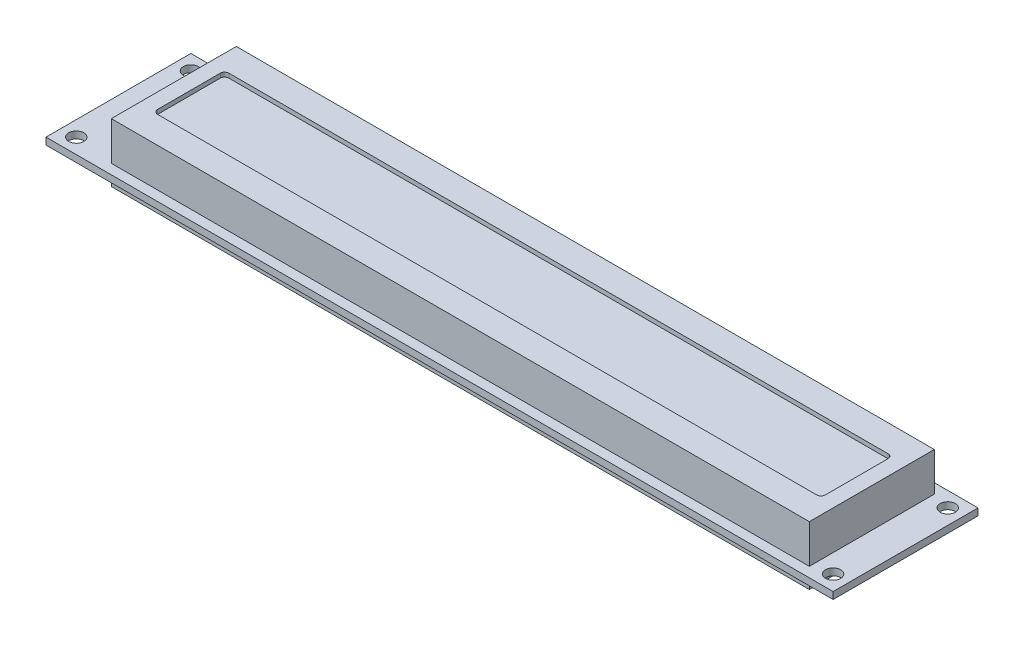
ISO-10303-21;
HEADER;
FILE_DESCRIPTION(('STEP AP214'),'2;1');
FILE_NAME('part.step','',(''),(''),'','','');
FILE_SCHEMA(('AUTOMOTIVE_DESIGN { 1 0 10303 214 1 1 1 1 }'));
ENDSEC;
DATA;
#1=APPLICATION_CONTEXT('core data for automotive mechanical design processes');
#2=APPLICATION_PROTOCOL_DEFINITION('international standard','automotive_design',2000,#1);
#3=PRODUCT_CONTEXT('',#1,'mechanical');
#4=PRODUCT('Part','Part','',(#3));
#5=PRODUCT_RELATED_PRODUCT_CATEGORY('part','',(#4));
#6=PRODUCT_DEFINITION_FORMATION('','',#4);
#7=PRODUCT_DEFINITION_CONTEXT('part definition',#1,'design');
#8=PRODUCT_DEFINITION('design','',#6,#7);
#9=PRODUCT_DEFINITION_SHAPE('','',#8);
#10=(LENGTH_UNIT() NAMED_UNIT(*) SI_UNIT(.MILLI.,.METRE.));
#11=(NAMED_UNIT(*) PLANE_ANGLE_UNIT() SI_UNIT($,.RADIAN.));
#12=(NAMED_UNIT(*) SI_UNIT($,.STERADIAN.) SOLID_ANGLE_UNIT());
#13=UNCERTAINTY_MEASURE_WITH_UNIT(LENGTH_MEASURE(1.E-05),#10,'distance_accuracy_value','');
#14=(GEOMETRIC_REPRESENTATION_CONTEXT(3) GLOBAL_UNCERTAINTY_ASSIGNED_CONTEXT((#13)) GLOBAL_UNIT_ASSIGNED_CONTEXT((#10,
#11,#12)) REPRESENTATION_CONTEXT('',''));
#15=CARTESIAN_POINT('',(0.,0.,0.));
#16=DIRECTION('',(0.,0.,1.));
#17=DIRECTION('',(1.,0.,0.));
#18=AXIS2_PLACEMENT_3D('',#15,#16,#17);
#19=CARTESIAN_POINT('',(-80.2723957939938,1.6,30.5652583984823));
#20=DIRECTION('',(0.,1.,0.));
#21=DIRECTION('',(0.,0.,1.));
#22=AXIS2_PLACEMENT_3D('',#19,#20,#21);
#23=PLANE('',#22);
#24=CARTESIAN_POINT('',(98.2276042060062,1.6,27.0652583984823));
#25=DIRECTION('',(0.,1.,0.));
#26=DIRECTION('',(0.,0.,1.));
#27=AXIS2_PLACEMENT_3D('',#24,#25,#26);
#28=CIRCLE('',#27,1.75);
#29=CARTESIAN_POINT('',(98.2276042060062,1.6,28.8152583984823));
#30=VERTEX_POINT('',#29);
#31=EDGE_CURVE('E291',#30,#30,#28,.T.);
#32=ORIENTED_EDGE('',*,*,#31,.F.);
#33=EDGE_LOOP('',(#32));
#34=FACE_BOUND('',#33,.T.);
#35=CARTESIAN_POINT('',(-76.7723957939938,1.6,27.0652583984823));
#36=DIRECTION('',(0.,1.,0.));
#37=DIRECTION('',(0.,0.,1.));
#38=AXIS2_PLACEMENT_3D('',#35,#36,#37);
#39=CIRCLE('',#38,1.75);
#40=CARTESIAN_POINT('',(-76.7723957939938,1.6,28.8152583984823));
#41=VERTEX_POINT('',#40);
#42=EDGE_CURVE('E285',#41,#41,#39,.T.);
#43=ORIENTED_EDGE('',*,*,#42,.F.);
#44=EDGE_LOOP('',(#43));
#45=FACE_BOUND('',#44,.T.);
#46=DIRECTION('',(0.,0.,1.));
#47=VECTOR('',#46,1.);
#48=CARTESIAN_POINT('',(-80.2723957939938,1.6,-2.93474160151774));
#49=LINE('',#48,#47);
#50=CARTESIAN_POINT('',(-80.2723957939938,1.6,-2.93474160151774));
#51=VERTEX_POINT('',#50);
#52=CARTESIAN_POINT('',(-80.2723957939938,1.6,30.5652583984823));
#53=VERTEX_POINT('',#52);
#54=EDGE_CURVE('E253',#51,#53,#49,.T.);
#55=ORIENTED_EDGE('',*,*,#54,.T.);
#56=DIRECTION('',(1.,0.,0.));
#57=VECTOR('',#56,1.);
#58=CARTESIAN_POINT('',(-80.2723957939938,1.6,30.5652583984823));
#59=LINE('',#58,#57);
#60=CARTESIAN_POINT('',(101.727604206006,1.6,30.5652583984823));
#61=VERTEX_POINT('',#60);
#62=EDGE_CURVE('E256',#53,#61,#59,.T.);
#63=ORIENTED_EDGE('',*,*,#62,.T.);
#64=DIRECTION('',(0.,0.,-1.));
#65=VECTOR('',#64,1.);
#66=CARTESIAN_POINT('',(101.727604206006,1.6,-2.93474160151774));
#67=LINE('',#66,#65);
#68=CARTESIAN_POINT('',(101.727604206006,1.6,-2.93474160151774));
#69=VERTEX_POINT('',#68);
#70=EDGE_CURVE('E259',#61,#69,#67,.T.);
#71=ORIENTED_EDGE('',*,*,#70,.T.);
#72=DIRECTION('',(-1.,0.,0.));
#73=VECTOR('',#72,1.);
#74=CARTESIAN_POINT('',(-80.2723957939938,1.6,-2.93474160151774));
#75=LINE('',#74,#73);
#76=EDGE_CURVE('E261',#69,#51,#75,.T.);
#77=ORIENTED_EDGE('',*,*,#76,.T.);
#78=EDGE_LOOP('',(#55,#63,#71,#77));
#79=FACE_BOUND('',#78,.T.);
#80=CARTESIAN_POINT('',(-76.7723957939938,1.6,0.565258398482257));
#81=DIRECTION('',(0.,1.,0.));
#82=DIRECTION('',(0.,0.,1.));
#83=AXIS2_PLACEMENT_3D('',#80,#81,#82);
#84=CIRCLE('',#83,1.75);
#85=CARTESIAN_POINT('',(-76.7723957939938,1.6,2.31525839848225));
#86=VERTEX_POINT('',#85);
#87=EDGE_CURVE('E246',#86,#86,#84,.T.);
#88=ORIENTED_EDGE('',*,*,#87,.F.);
#89=EDGE_LOOP('',(#88));
#90=FACE_BOUND('',#89,.T.);
#91=CARTESIAN_POINT('',(98.2276042060062,1.6,0.565258398482257));
#92=DIRECTION('',(0.,1.,0.));
#93=DIRECTION('',(0.,0.,1.));
#94=AXIS2_PLACEMENT_3D('',#91,#92,#93);
#95=CIRCLE('',#94,1.75);
#96=CARTESIAN_POINT('',(98.2276042060062,1.6,2.31525839848225));
#97=VERTEX_POINT('',#96);
#98=EDGE_CURVE('E243',#97,#97,#95,.T.);
#99=ORIENTED_EDGE('',*,*,#98,.F.);
#100=EDGE_LOOP('',(#99));
#101=FACE_BOUND('',#100,.T.);
#102=DIRECTION('',(1.,0.,0.));
#103=VECTOR('',#102,1.);
#104=CARTESIAN_POINT('',(-67.4723957939938,1.6,28.2652583984823));
#105=LINE('',#104,#103);
#106=CARTESIAN_POINT('',(-67.4723957939938,1.6,28.2652583984823));
#107=VERTEX_POINT('',#106);
#108=CARTESIAN_POINT('',(93.9276042060062,1.6,28.2652583984823));
#109=VERTEX_POINT('',#108);
#110=EDGE_CURVE('E225',#107,#109,#105,.T.);
#111=ORIENTED_EDGE('',*,*,#110,.F.);
#112=DIRECTION('',(0.,0.,1.));
#113=VECTOR('',#112,1.);
#114=CARTESIAN_POINT('',(-67.4723957939938,1.6,-0.634741601517739));
#115=LINE('',#114,#113);
#116=CARTESIAN_POINT('',(-67.4723957939938,1.6,-0.634741601517739));
#117=VERTEX_POINT('',#116);
#118=EDGE_CURVE('E207',#117,#107,#115,.T.);
#119=ORIENTED_EDGE('',*,*,#118,.F.);
#120=DIRECTION('',(-1.,0.,0.));
#121=VECTOR('',#120,1.);
#122=CARTESIAN_POINT('',(-67.4723957939938,1.6,-0.634741601517739));
#123=LINE('',#122,#121);
#124=CARTESIAN_POINT('',(93.9276042060062,1.6,-0.63474160151774));
#125=VERTEX_POINT('',#124);
#126=EDGE_CURVE('E216',#125,#117,#123,.T.);
#127=ORIENTED_EDGE('',*,*,#126,.F.);
#128=DIRECTION('',(0.,0.,-1.));
#129=VECTOR('',#128,1.);
#130=CARTESIAN_POINT('',(93.9276042060062,1.6,-0.634741601517739));
#131=LINE('',#130,#129);
#132=EDGE_CURVE('E227',#109,#125,#131,.T.);
#133=ORIENTED_EDGE('',*,*,#132,.F.);
#134=EDGE_LOOP('',(#111,#119,#127,#133));
#135=FACE_BOUND('',#134,.T.);
#136=ADVANCED_FACE('F34',(#34,#45,#79,#90,#101,#135),#23,.T.);
#137=CARTESIAN_POINT('',(-80.2723957939938,1.6,-2.93474160151774));
#138=DIRECTION('',(1.,0.,0.));
#139=DIRECTION('',(0.,0.,-1.));
#140=AXIS2_PLACEMENT_3D('',#137,#138,#139);
#141=PLANE('',#140);
#142=DIRECTION('',(0.,0.,1.));
#143=VECTOR('',#142,1.);
#144=CARTESIAN_POINT('',(-80.2723957939938,0.,-2.93474160151774));
#145=LINE('',#144,#143);
#146=CARTESIAN_POINT('',(-80.2723957939938,0.,-2.93474160151774));
#147=VERTEX_POINT('',#146);
#148=CARTESIAN_POINT('',(-80.2723957939938,0.,30.5652583984823));
#149=VERTEX_POINT('',#148);
#150=EDGE_CURVE('E250',#147,#149,#145,.T.);
#151=ORIENTED_EDGE('',*,*,#150,.T.);
#152=DIRECTION('',(0.,-1.,0.));
#153=VECTOR('',#152,1.);
#154=CARTESIAN_POINT('',(-80.2723957939938,1.6,30.5652583984823));
#155=LINE('',#154,#153);
#156=EDGE_CURVE('E279',#53,#149,#155,.T.);
#157=ORIENTED_EDGE('',*,*,#156,.F.);
#158=ORIENTED_EDGE('',*,*,#54,.F.);
#159=DIRECTION('',(0.,-1.,0.));
#160=VECTOR('',#159,1.);
#161=CARTESIAN_POINT('',(-80.2723957939938,1.6,-2.93474160151774));
#162=LINE('',#161,#160);
#163=EDGE_CURVE('E263',#51,#147,#162,.T.);
#164=ORIENTED_EDGE('',*,*,#163,.T.);
#165=EDGE_LOOP('',(#151,#157,#158,#164));
#166=FACE_BOUND('',#165,.T.);
#167=ADVANCED_FACE('F357',(#166),#141,.F.);
#168=CARTESIAN_POINT('',(-80.2723957939938,1.6,30.5652583984823));
#169=DIRECTION('',(0.,0.,-1.));
#170=DIRECTION('',(-1.,0.,0.));
#171=AXIS2_PLACEMENT_3D('',#168,#169,#170);
#172=PLANE('',#171);
#173=DIRECTION('',(1.,0.,0.));
#174=VECTOR('',#173,1.);
#175=CARTESIAN_POINT('',(-80.2723957939938,0.,30.5652583984823));
#176=LINE('',#175,#174);
#177=CARTESIAN_POINT('',(101.727604206006,0.,30.5652583984823));
#178=VERTEX_POINT('',#177);
#179=EDGE_CURVE('E266',#149,#178,#176,.T.);
#180=ORIENTED_EDGE('',*,*,#179,.T.);
#181=DIRECTION('',(0.,-1.,0.));
#182=VECTOR('',#181,1.);
#183=CARTESIAN_POINT('',(101.727604206006,1.6,30.5652583984823));
#184=LINE('',#183,#182);
#185=EDGE_CURVE('E276',#61,#178,#184,.T.);
#186=ORIENTED_EDGE('',*,*,#185,.F.);
#187=ORIENTED_EDGE('',*,*,#62,.F.);
#188=ORIENTED_EDGE('',*,*,#156,.T.);
#189=EDGE_LOOP('',(#180,#186,#187,#188));
#190=FACE_BOUND('',#189,.T.);
#191=ADVANCED_FACE('F363',(#190),#172,.F.);
#192=CARTESIAN_POINT('',(101.727604206006,1.6,-2.93474160151774));
#193=DIRECTION('',(-1.,0.,0.));
#194=DIRECTION('',(0.,0.,1.));
#195=AXIS2_PLACEMENT_3D('',#192,#193,#194);
#196=PLANE('',#195);
#197=DIRECTION('',(0.,0.,-1.));
#198=VECTOR('',#197,1.);
#199=CARTESIAN_POINT('',(101.727604206006,0.,-2.93474160151774));
#200=LINE('',#199,#198);
#201=CARTESIAN_POINT('',(101.727604206006,0.,-2.93474160151774));
#202=VERTEX_POINT('',#201);
#203=EDGE_CURVE('E268',#178,#202,#200,.T.);
#204=ORIENTED_EDGE('',*,*,#203,.T.);
#205=DIRECTION('',(0.,-1.,0.));
#206=VECTOR('',#205,1.);
#207=CARTESIAN_POINT('',(101.727604206006,1.6,-2.93474160151774));
#208=LINE('',#207,#206);
#209=EDGE_CURVE('E273',#69,#202,#208,.T.);
#210=ORIENTED_EDGE('',*,*,#209,.F.);
#211=ORIENTED_EDGE('',*,*,#70,.F.);
#212=ORIENTED_EDGE('',*,*,#185,.T.);
#213=EDGE_LOOP('',(#204,#210,#211,#212));
#214=FACE_BOUND('',#213,.T.);
#215=ADVANCED_FACE('F379',(#214),#196,.F.);
#216=CARTESIAN_POINT('',(-80.2723957939938,1.6,-2.93474160151774));
#217=DIRECTION('',(0.,0.,1.));
#218=DIRECTION('',(1.,0.,0.));
#219=AXIS2_PLACEMENT_3D('',#216,#217,#218);
#220=PLANE('',#219);
#221=DIRECTION('',(-1.,0.,0.));
#222=VECTOR('',#221,1.);
#223=CARTESIAN_POINT('',(-80.2723957939938,0.,-2.93474160151774));
#224=LINE('',#223,#222);
#225=EDGE_CURVE('E257',#202,#147,#224,.T.);
#226=ORIENTED_EDGE('',*,*,#225,.T.);
#227=ORIENTED_EDGE('',*,*,#163,.F.);
#228=ORIENTED_EDGE('',*,*,#76,.F.);
#229=ORIENTED_EDGE('',*,*,#209,.T.);
#230=EDGE_LOOP('',(#226,#227,#228,#229));
#231=FACE_BOUND('',#230,.T.);
#232=ADVANCED_FACE('F375',(#231),#220,.F.);
#233=CARTESIAN_POINT('',(-80.2723957939938,0.,30.5652583984823));
#234=DIRECTION('',(0.,1.,0.));
#235=DIRECTION('',(0.,0.,1.));
#236=AXIS2_PLACEMENT_3D('',#233,#234,#235);
#237=PLANE('',#236);
#238=DIRECTION('',(-1.,0.,0.));
#239=VECTOR('',#238,1.);
#240=CARTESIAN_POINT('',(-80.2723957939938,0.,-0.63474160151774));
#241=LINE('',#240,#239);
#242=CARTESIAN_POINT('',(93.9276042060062,0.,-0.634741601517739));
#243=VERTEX_POINT('',#242);
#244=CARTESIAN_POINT('',(-67.4723957939938,0.,-0.634741601517739));
#245=VERTEX_POINT('',#244);
#246=EDGE_CURVE('E298',#243,#245,#241,.T.);
#247=ORIENTED_EDGE('',*,*,#246,.T.);
#248=DIRECTION('',(0.,0.,1.));
#249=VECTOR('',#248,1.);
#250=CARTESIAN_POINT('',(-67.4723957939938,0.,30.5652583984823));
#251=LINE('',#250,#249);
#252=CARTESIAN_POINT('',(-67.4723957939938,0.,28.2652583984823));
#253=VERTEX_POINT('',#252);
#254=EDGE_CURVE('E301',#245,#253,#251,.T.);
#255=ORIENTED_EDGE('',*,*,#254,.T.);
#256=DIRECTION('',(1.,0.,0.));
#257=VECTOR('',#256,1.);
#258=CARTESIAN_POINT('',(-80.2723957939938,0.,28.2652583984823));
#259=LINE('',#258,#257);
#260=CARTESIAN_POINT('',(93.9276042060062,0.,28.2652583984823));
#261=VERTEX_POINT('',#260);
#262=EDGE_CURVE('E176',#253,#261,#259,.T.);
#263=ORIENTED_EDGE('',*,*,#262,.T.);
#264=DIRECTION('',(0.,0.,-1.));
#265=VECTOR('',#264,1.);
#266=CARTESIAN_POINT('',(93.9276042060062,0.,30.5652583984822));
#267=LINE('',#266,#265);
#268=EDGE_CURVE('E295',#261,#243,#267,.T.);
#269=ORIENTED_EDGE('',*,*,#268,.T.);
#270=EDGE_LOOP('',(#247,#255,#263,#269));
#271=FACE_BOUND('',#270,.T.);
#272=CARTESIAN_POINT('',(98.2276042060062,0.,0.565258398482257));
#273=DIRECTION('',(0.,1.,0.));
#274=DIRECTION('',(0.,0.,1.));
#275=AXIS2_PLACEMENT_3D('',#272,#273,#274);
#276=CIRCLE('',#275,1.75);
#277=CARTESIAN_POINT('',(98.2276042060062,0.,2.31525839848225));
#278=VERTEX_POINT('',#277);
#279=EDGE_CURVE('E240',#278,#278,#276,.T.);
#280=ORIENTED_EDGE('',*,*,#279,.T.);
#281=EDGE_LOOP('',(#280));
#282=FACE_BOUND('',#281,.T.);
#283=CARTESIAN_POINT('',(-76.7723957939938,0.,0.565258398482257));
#284=DIRECTION('',(0.,1.,0.));
#285=DIRECTION('',(0.,0.,1.));
#286=AXIS2_PLACEMENT_3D('',#283,#284,#285);
#287=CIRCLE('',#286,1.75);
#288=CARTESIAN_POINT('',(-76.7723957939938,0.,2.31525839848225));
#289=VERTEX_POINT('',#288);
#290=EDGE_CURVE('E247',#289,#289,#287,.T.);
#291=ORIENTED_EDGE('',*,*,#290,.T.);
#292=EDGE_LOOP('',(#291));
#293=FACE_BOUND('',#292,.T.);
#294=ORIENTED_EDGE('',*,*,#150,.F.);
#295=ORIENTED_EDGE('',*,*,#225,.F.);
#296=ORIENTED_EDGE('',*,*,#203,.F.);
#297=ORIENTED_EDGE('',*,*,#179,.F.);
#298=EDGE_LOOP('',(#294,#295,#296,#297));
#299=FACE_BOUND('',#298,.T.);
#300=CARTESIAN_POINT('',(-76.7723957939938,0.,27.0652583984823));
#301=DIRECTION('',(0.,1.,0.));
#302=DIRECTION('',(0.,0.,1.));
#303=AXIS2_PLACEMENT_3D('',#300,#301,#302);
#304=CIRCLE('',#303,1.75);
#305=CARTESIAN_POINT('',(-76.7723957939938,0.,28.8152583984823));
#306=VERTEX_POINT('',#305);
#307=EDGE_CURVE('E282',#306,#306,#304,.T.);
#308=ORIENTED_EDGE('',*,*,#307,.T.);
#309=EDGE_LOOP('',(#308));
#310=FACE_BOUND('',#309,.T.);
#311=CARTESIAN_POINT('',(98.2276042060062,0.,27.0652583984823));
#312=DIRECTION('',(0.,1.,0.));
#313=DIRECTION('',(0.,0.,1.));
#314=AXIS2_PLACEMENT_3D('',#311,#312,#313);
#315=CIRCLE('',#314,1.75);
#316=CARTESIAN_POINT('',(98.2276042060062,0.,28.8152583984823));
#317=VERTEX_POINT('',#316);
#318=EDGE_CURVE('E288',#317,#317,#315,.T.);
#319=ORIENTED_EDGE('',*,*,#318,.T.);
#320=EDGE_LOOP('',(#319));
#321=FACE_BOUND('',#320,.T.);
#322=ADVANCED_FACE('F372',(#271,#282,#293,#299,#310,#321),#237,.F.);
#323=CARTESIAN_POINT('',(-76.7723957939938,0.,0.565258398482257));
#324=DIRECTION('',(0.,1.,0.));
#325=DIRECTION('',(0.,0.,1.));
#326=AXIS2_PLACEMENT_3D('',#323,#324,#325);
#327=CYLINDRICAL_SURFACE('',#326,1.75);
#328=ORIENTED_EDGE('',*,*,#290,.F.);
#329=EDGE_LOOP('',(#328));
#330=FACE_BOUND('',#329,.T.);
#331=ORIENTED_EDGE('',*,*,#87,.T.);
#332=EDGE_LOOP('',(#331));
#333=FACE_BOUND('',#332,.T.);
#334=ADVANCED_FACE('F370',(#330,#333),#327,.F.);
#335=CARTESIAN_POINT('',(98.2276042060062,0.,0.565258398482257));
#336=DIRECTION('',(0.,1.,0.));
#337=DIRECTION('',(0.,0.,1.));
#338=AXIS2_PLACEMENT_3D('',#335,#336,#337);
#339=CYLINDRICAL_SURFACE('',#338,1.75);
#340=ORIENTED_EDGE('',*,*,#279,.F.);
#341=EDGE_LOOP('',(#340));
#342=FACE_BOUND('',#341,.T.);
#343=ORIENTED_EDGE('',*,*,#98,.T.);
#344=EDGE_LOOP('',(#343));
#345=FACE_BOUND('',#344,.T.);
#346=ADVANCED_FACE('F391',(#342,#345),#339,.F.);
#347=CARTESIAN_POINT('',(-76.7723957939938,0.,27.0652583984823));
#348=DIRECTION('',(0.,1.,0.));
#349=DIRECTION('',(0.,0.,1.));
#350=AXIS2_PLACEMENT_3D('',#347,#348,#349);
#351=CYLINDRICAL_SURFACE('',#350,1.75);
#352=ORIENTED_EDGE('',*,*,#307,.F.);
#353=EDGE_LOOP('',(#352));
#354=FACE_BOUND('',#353,.T.);
#355=ORIENTED_EDGE('',*,*,#42,.T.);
#356=EDGE_LOOP('',(#355));
#357=FACE_BOUND('',#356,.T.);
#358=ADVANCED_FACE('F387',(#354,#357),#351,.F.);
#359=CARTESIAN_POINT('',(98.2276042060062,0.,27.0652583984823));
#360=DIRECTION('',(0.,1.,0.));
#361=DIRECTION('',(0.,0.,1.));
#362=AXIS2_PLACEMENT_3D('',#359,#360,#361);
#363=CYLINDRICAL_SURFACE('',#362,1.75);
#364=ORIENTED_EDGE('',*,*,#318,.F.);
#365=EDGE_LOOP('',(#364));
#366=FACE_BOUND('',#365,.T.);
#367=ORIENTED_EDGE('',*,*,#31,.T.);
#368=EDGE_LOOP('',(#367));
#369=FACE_BOUND('',#368,.T.);
#370=ADVANCED_FACE('F390',(#366,#369),#363,.F.);
#371=CARTESIAN_POINT('',(-67.4723957939938,10.55,-0.634741601517739));
#372=DIRECTION('',(1.,0.,0.));
#373=DIRECTION('',(0.,0.,-1.));
#374=AXIS2_PLACEMENT_3D('',#371,#372,#373);
#375=PLANE('',#374);
#376=ORIENTED_EDGE('',*,*,#118,.T.);
#377=DIRECTION('',(0.,-1.,0.));
#378=VECTOR('',#377,1.);
#379=CARTESIAN_POINT('',(-67.4723957939938,10.55,28.2652583984823));
#380=LINE('',#379,#378);
#381=CARTESIAN_POINT('',(-67.4723957939938,10.55,28.2652583984823));
#382=VERTEX_POINT('',#381);
#383=EDGE_CURVE('E238',#382,#107,#380,.T.);
#384=ORIENTED_EDGE('',*,*,#383,.F.);
#385=DIRECTION('',(0.,0.,1.));
#386=VECTOR('',#385,1.);
#387=CARTESIAN_POINT('',(-67.4723957939938,10.55,-0.634741601517739));
#388=LINE('',#387,#386);
#389=CARTESIAN_POINT('',(-67.4723957939938,10.55,-0.634741601517739));
#390=VERTEX_POINT('',#389);
#391=EDGE_CURVE('E212',#390,#382,#388,.T.);
#392=ORIENTED_EDGE('',*,*,#391,.F.);
#393=DIRECTION('',(0.,-1.,0.));
#394=VECTOR('',#393,1.);
#395=CARTESIAN_POINT('',(-67.4723957939938,10.55,-0.634741601517739));
#396=LINE('',#395,#394);
#397=EDGE_CURVE('E222',#390,#117,#396,.T.);
#398=ORIENTED_EDGE('',*,*,#397,.T.);
#399=EDGE_LOOP('',(#376,#384,#392,#398));
#400=FACE_BOUND('',#399,.T.);
#401=ADVANCED_FACE('F395',(#400),#375,.F.);
#402=CARTESIAN_POINT('',(-67.4723957939938,10.55,28.2652583984823));
#403=DIRECTION('',(0.,0.,-1.));
#404=DIRECTION('',(-1.,0.,0.));
#405=AXIS2_PLACEMENT_3D('',#402,#403,#404);
#406=PLANE('',#405);
#407=ORIENTED_EDGE('',*,*,#110,.T.);
#408=DIRECTION('',(0.,-1.,0.));
#409=VECTOR('',#408,1.);
#410=CARTESIAN_POINT('',(93.9276042060062,10.55,28.2652583984823));
#411=LINE('',#410,#409);
#412=CARTESIAN_POINT('',(93.9276042060062,10.55,28.2652583984823));
#413=VERTEX_POINT('',#412);
#414=EDGE_CURVE('E235',#413,#109,#411,.T.);
#415=ORIENTED_EDGE('',*,*,#414,.F.);
#416=DIRECTION('',(1.,0.,0.));
#417=VECTOR('',#416,1.);
#418=CARTESIAN_POINT('',(-67.4723957939938,10.55,28.2652583984823));
#419=LINE('',#418,#417);
#420=EDGE_CURVE('E215',#382,#413,#419,.T.);
#421=ORIENTED_EDGE('',*,*,#420,.F.);
#422=ORIENTED_EDGE('',*,*,#383,.T.);
#423=EDGE_LOOP('',(#407,#415,#421,#422));
#424=FACE_BOUND('',#423,.T.);
#425=ADVANCED_FACE('F465',(#424),#406,.F.);
#426=CARTESIAN_POINT('',(93.9276042060062,10.55,-0.634741601517739));
#427=DIRECTION('',(-1.,0.,0.));
#428=DIRECTION('',(0.,0.,1.));
#429=AXIS2_PLACEMENT_3D('',#426,#427,#428);
#430=PLANE('',#429);
#431=ORIENTED_EDGE('',*,*,#132,.T.);
#432=DIRECTION('',(0.,-1.,0.));
#433=VECTOR('',#432,1.);
#434=CARTESIAN_POINT('',(93.9276042060062,10.55,-0.634741601517739));
#435=LINE('',#434,#433);
#436=CARTESIAN_POINT('',(93.9276042060062,10.55,-0.634741601517739));
#437=VERTEX_POINT('',#436);
#438=EDGE_CURVE('E233',#437,#125,#435,.T.);
#439=ORIENTED_EDGE('',*,*,#438,.F.);
#440=DIRECTION('',(0.,0.,-1.));
#441=VECTOR('',#440,1.);
#442=CARTESIAN_POINT('',(93.9276042060062,10.55,-0.634741601517739));
#443=LINE('',#442,#441);
#444=EDGE_CURVE('E218',#413,#437,#443,.T.);
#445=ORIENTED_EDGE('',*,*,#444,.F.);
#446=ORIENTED_EDGE('',*,*,#414,.T.);
#447=EDGE_LOOP('',(#431,#439,#445,#446));
#448=FACE_BOUND('',#447,.T.);
#449=ADVANCED_FACE('F461',(#448),#430,.F.);
#450=CARTESIAN_POINT('',(-67.4723957939938,10.55,-0.634741601517739));
#451=DIRECTION('',(0.,0.,1.));
#452=DIRECTION('',(1.,0.,0.));
#453=AXIS2_PLACEMENT_3D('',#450,#451,#452);
#454=PLANE('',#453);
#455=ORIENTED_EDGE('',*,*,#126,.T.);
#456=ORIENTED_EDGE('',*,*,#397,.F.);
#457=DIRECTION('',(-1.,0.,0.));
#458=VECTOR('',#457,1.);
#459=CARTESIAN_POINT('',(-67.4723957939938,10.55,-0.634741601517739));
#460=LINE('',#459,#458);
#461=EDGE_CURVE('E220',#437,#390,#460,.T.);
#462=ORIENTED_EDGE('',*,*,#461,.F.);
#463=ORIENTED_EDGE('',*,*,#438,.T.);
#464=EDGE_LOOP('',(#455,#456,#462,#463));
#465=FACE_BOUND('',#464,.T.);
#466=ADVANCED_FACE('F458',(#465),#454,.F.);
#467=CARTESIAN_POINT('',(-67.4723957939938,10.55,28.2652583984823));
#468=DIRECTION('',(0.,1.,0.));
#469=DIRECTION('',(0.,0.,1.));
#470=AXIS2_PLACEMENT_3D('',#467,#468,#469);
#471=PLANE('',#470);
#472=DIRECTION('',(0.,0.,1.));
#473=VECTOR('',#472,1.);
#474=CARTESIAN_POINT('',(-63.9723957939938,10.55,5.56525839848226));
#475=LINE('',#474,#473);
#476=CARTESIAN_POINT('',(-63.9723957939938,10.55,6.56525839848226));
#477=VERTEX_POINT('',#476);
#478=CARTESIAN_POINT('',(-63.9723957939938,10.55,21.0652583984823));
#479=VERTEX_POINT('',#478);
#480=EDGE_CURVE('E415',#477,#479,#475,.T.);
#481=ORIENTED_EDGE('',*,*,#480,.F.);
#482=CARTESIAN_POINT('',(-62.9723957939938,10.55,6.56525839848226));
#483=DIRECTION('',(0.,1.,0.));
#484=DIRECTION('',(0.,0.,1.));
#485=AXIS2_PLACEMENT_3D('',#482,#483,#484);
#486=CIRCLE('',#485,1.);
#487=CARTESIAN_POINT('',(-62.9723957939938,10.55,5.56525839848226));
#488=VERTEX_POINT('',#487);
#489=EDGE_CURVE('E311',#477,#488,#486,.F.);
#490=ORIENTED_EDGE('',*,*,#489,.T.);
#491=DIRECTION('',(-1.,0.,0.));
#492=VECTOR('',#491,1.);
#493=CARTESIAN_POINT('',(-63.9723957939938,10.55,5.56525839848226));
#494=LINE('',#493,#492);
#495=CARTESIAN_POINT('',(89.4276042060062,10.55,5.56525839848226));
#496=VERTEX_POINT('',#495);
#497=EDGE_CURVE('E201',#496,#488,#494,.T.);
#498=ORIENTED_EDGE('',*,*,#497,.F.);
#499=CARTESIAN_POINT('',(89.4276042060062,10.55,6.56525839848226));
#500=DIRECTION('',(0.,1.,0.));
#501=DIRECTION('',(0.,0.,1.));
#502=AXIS2_PLACEMENT_3D('',#499,#500,#501);
#503=CIRCLE('',#502,1.);
#504=CARTESIAN_POINT('',(90.4276042060062,10.55,6.56525839848226));
#505=VERTEX_POINT('',#504);
#506=EDGE_CURVE('E331',#496,#505,#503,.F.);
#507=ORIENTED_EDGE('',*,*,#506,.T.);
#508=DIRECTION('',(0.,0.,-1.));
#509=VECTOR('',#508,1.);
#510=CARTESIAN_POINT('',(90.4276042060062,10.55,5.56525839848226));
#511=LINE('',#510,#509);
#512=CARTESIAN_POINT('',(90.4276042060062,10.55,21.0652583984823));
#513=VERTEX_POINT('',#512);
#514=EDGE_CURVE('E419',#513,#505,#511,.T.);
#515=ORIENTED_EDGE('',*,*,#514,.F.);
#516=CARTESIAN_POINT('',(89.4276042060062,10.55,21.0652583984823));
#517=DIRECTION('',(0.,1.,0.));
#518=DIRECTION('',(0.,0.,1.));
#519=AXIS2_PLACEMENT_3D('',#516,#517,#518);
#520=CIRCLE('',#519,1.);
#521=CARTESIAN_POINT('',(89.4276042060062,10.55,22.0652583984823));
#522=VERTEX_POINT('',#521);
#523=EDGE_CURVE('E11',#513,#522,#520,.F.);
#524=ORIENTED_EDGE('',*,*,#523,.T.);
#525=DIRECTION('',(1.,0.,0.));
#526=VECTOR('',#525,1.);
#527=CARTESIAN_POINT('',(-63.9723957939938,10.55,22.0652583984823));
#528=LINE('',#527,#526);
#529=CARTESIAN_POINT('',(-62.9723957939938,10.55,22.0652583984823));
#530=VERTEX_POINT('',#529);
#531=EDGE_CURVE('E418',#530,#522,#528,.T.);
#532=ORIENTED_EDGE('',*,*,#531,.F.);
#533=CARTESIAN_POINT('',(-62.9723957939938,10.55,21.0652583984823));
#534=DIRECTION('',(0.,1.,0.));
#535=DIRECTION('',(0.,0.,1.));
#536=AXIS2_PLACEMENT_3D('',#533,#534,#535);
#537=CIRCLE('',#536,1.);
#538=EDGE_CURVE('E321',#530,#479,#537,.F.);
#539=ORIENTED_EDGE('',*,*,#538,.T.);
#540=EDGE_LOOP('',(#481,#490,#498,#507,#515,#524,#532,#539));
#541=FACE_BOUND('',#540,.T.);
#542=ORIENTED_EDGE('',*,*,#391,.T.);
#543=ORIENTED_EDGE('',*,*,#420,.T.);
#544=ORIENTED_EDGE('',*,*,#444,.T.);
#545=ORIENTED_EDGE('',*,*,#461,.T.);
#546=EDGE_LOOP('',(#542,#543,#544,#545));
#547=FACE_BOUND('',#546,.T.);
#548=ADVANCED_FACE('F428',(#541,#547),#471,.T.);
#549=CARTESIAN_POINT('',(-67.4723957939938,-3.05,-0.634741601517739));
#550=DIRECTION('',(-1.,0.,0.));
#551=DIRECTION('',(0.,0.,1.));
#552=AXIS2_PLACEMENT_3D('',#549,#550,#551);
#553=PLANE('',#552);
#554=ORIENTED_EDGE('',*,*,#254,.F.);
#555=DIRECTION('',(0.,1.,0.));
#556=VECTOR('',#555,1.);
#557=CARTESIAN_POINT('',(-67.4723957939938,-3.05,-0.634741601517739));
#558=LINE('',#557,#556);
#559=CARTESIAN_POINT('',(-67.4723957939938,-3.05,-0.634741601517739));
#560=VERTEX_POINT('',#559);
#561=EDGE_CURVE('E195',#560,#245,#558,.T.);
#562=ORIENTED_EDGE('',*,*,#561,.F.);
#563=DIRECTION('',(0.,0.,1.));
#564=VECTOR('',#563,1.);
#565=CARTESIAN_POINT('',(-67.4723957939938,-3.05,-0.634741601517739));
#566=LINE('',#565,#564);
#567=CARTESIAN_POINT('',(-67.4723957939938,-3.05,28.2652583984823));
#568=VERTEX_POINT('',#567);
#569=EDGE_CURVE('E188',#560,#568,#566,.T.);
#570=ORIENTED_EDGE('',*,*,#569,.T.);
#571=DIRECTION('',(0.,1.,0.));
#572=VECTOR('',#571,1.);
#573=CARTESIAN_POINT('',(-67.4723957939938,-3.05,28.2652583984823));
#574=LINE('',#573,#572);
#575=EDGE_CURVE('E171',#568,#253,#574,.T.);
#576=ORIENTED_EDGE('',*,*,#575,.T.);
#577=EDGE_LOOP('',(#554,#562,#570,#576));
#578=FACE_BOUND('',#577,.T.);
#579=ADVANCED_FACE('F193',(#578),#553,.T.);
#580=CARTESIAN_POINT('',(-67.4723957939938,-3.05,-0.634741601517739));
#581=DIRECTION('',(0.,0.,-1.));
#582=DIRECTION('',(-1.,0.,0.));
#583=AXIS2_PLACEMENT_3D('',#580,#581,#582);
#584=PLANE('',#583);
#585=ORIENTED_EDGE('',*,*,#246,.F.);
#586=DIRECTION('',(0.,1.,0.));
#587=VECTOR('',#586,1.);
#588=CARTESIAN_POINT('',(93.9276042060062,-3.05,-0.634741601517739));
#589=LINE('',#588,#587);
#590=CARTESIAN_POINT('',(93.9276042060062,-3.05,-0.634741601517739));
#591=VERTEX_POINT('',#590);
#592=EDGE_CURVE('E208',#591,#243,#589,.T.);
#593=ORIENTED_EDGE('',*,*,#592,.F.);
#594=DIRECTION('',(-1.,0.,0.));
#595=VECTOR('',#594,1.);
#596=CARTESIAN_POINT('',(-67.4723957939938,-3.05,-0.634741601517739));
#597=LINE('',#596,#595);
#598=EDGE_CURVE('E181',#591,#560,#597,.T.);
#599=ORIENTED_EDGE('',*,*,#598,.T.);
#600=ORIENTED_EDGE('',*,*,#561,.T.);
#601=EDGE_LOOP('',(#585,#593,#599,#600));
#602=FACE_BOUND('',#601,.T.);
#603=ADVANCED_FACE('F444',(#602),#584,.T.);
#604=CARTESIAN_POINT('',(93.9276042060062,-3.05,-0.634741601517739));
#605=DIRECTION('',(1.,0.,0.));
#606=DIRECTION('',(0.,0.,-1.));
#607=AXIS2_PLACEMENT_3D('',#604,#605,#606);
#608=PLANE('',#607);
#609=ORIENTED_EDGE('',*,*,#268,.F.);
#610=DIRECTION('',(0.,1.,0.));
#611=VECTOR('',#610,1.);
#612=CARTESIAN_POINT('',(93.9276042060062,-3.05,28.2652583984823));
#613=LINE('',#612,#611);
#614=CARTESIAN_POINT('',(93.9276042060062,-3.05,28.2652583984823));
#615=VERTEX_POINT('',#614);
#616=EDGE_CURVE('E180',#615,#261,#613,.T.);
#617=ORIENTED_EDGE('',*,*,#616,.F.);
#618=DIRECTION('',(0.,0.,-1.));
#619=VECTOR('',#618,1.);
#620=CARTESIAN_POINT('',(93.9276042060062,-3.05,-0.634741601517739));
#621=LINE('',#620,#619);
#622=EDGE_CURVE('E191',#615,#591,#621,.T.);
#623=ORIENTED_EDGE('',*,*,#622,.T.);
#624=ORIENTED_EDGE('',*,*,#592,.T.);
#625=EDGE_LOOP('',(#609,#617,#623,#624));
#626=FACE_BOUND('',#625,.T.);
#627=ADVANCED_FACE('F447',(#626),#608,.T.);
#628=CARTESIAN_POINT('',(-67.4723957939938,-3.05,28.2652583984823));
#629=DIRECTION('',(0.,0.,1.));
#630=DIRECTION('',(1.,0.,0.));
#631=AXIS2_PLACEMENT_3D('',#628,#629,#630);
#632=PLANE('',#631);
#633=ORIENTED_EDGE('',*,*,#262,.F.);
#634=ORIENTED_EDGE('',*,*,#575,.F.);
#635=DIRECTION('',(1.,0.,0.));
#636=VECTOR('',#635,1.);
#637=CARTESIAN_POINT('',(-67.4723957939938,-3.05,28.2652583984823));
#638=LINE('',#637,#636);
#639=EDGE_CURVE('E174',#568,#615,#638,.T.);
#640=ORIENTED_EDGE('',*,*,#639,.T.);
#641=ORIENTED_EDGE('',*,*,#616,.T.);
#642=EDGE_LOOP('',(#633,#634,#640,#641));
#643=FACE_BOUND('',#642,.T.);
#644=ADVANCED_FACE('F173',(#643),#632,.T.);
#645=CARTESIAN_POINT('',(-67.4723957939938,-3.05,28.2652583984823));
#646=DIRECTION('',(0.,1.,0.));
#647=DIRECTION('',(0.,0.,1.));
#648=AXIS2_PLACEMENT_3D('',#645,#646,#647);
#649=PLANE('',#648);
#650=ORIENTED_EDGE('',*,*,#569,.F.);
#651=ORIENTED_EDGE('',*,*,#598,.F.);
#652=ORIENTED_EDGE('',*,*,#622,.F.);
#653=ORIENTED_EDGE('',*,*,#639,.F.);
#654=EDGE_LOOP('',(#650,#651,#652,#653));
#655=FACE_BOUND('',#654,.T.);
#656=ADVANCED_FACE('F186',(#655),#649,.F.);
#657=CARTESIAN_POINT('',(-63.9723957939938,9.55,5.56525839848226));
#658=DIRECTION('',(-1.,0.,0.));
#659=DIRECTION('',(0.,0.,1.));
#660=AXIS2_PLACEMENT_3D('',#657,#658,#659);
#661=PLANE('',#660);
#662=ORIENTED_EDGE('',*,*,#480,.T.);
#663=DIRECTION('',(0.,1.,0.));
#664=VECTOR('',#663,1.);
#665=CARTESIAN_POINT('',(-63.9723957939938,9.55,21.0652583984823));
#666=LINE('',#665,#664);
#667=CARTESIAN_POINT('',(-63.9723957939938,9.55,21.0652583984823));
#668=VERTEX_POINT('',#667);
#669=EDGE_CURVE('E317',#479,#668,#666,.F.);
#670=ORIENTED_EDGE('',*,*,#669,.T.);
#671=DIRECTION('',(0.,0.,1.));
#672=VECTOR('',#671,1.);
#673=CARTESIAN_POINT('',(-63.9723957939938,9.55,5.56525839848226));
#674=LINE('',#673,#672);
#675=CARTESIAN_POINT('',(-63.9723957939938,9.55,6.56525839848226));
#676=VERTEX_POINT('',#675);
#677=EDGE_CURVE('E410',#676,#668,#674,.T.);
#678=ORIENTED_EDGE('',*,*,#677,.F.);
#679=DIRECTION('',(0.,1.,0.));
#680=VECTOR('',#679,1.);
#681=CARTESIAN_POINT('',(-63.9723957939938,10.55,6.56525839848226));
#682=LINE('',#681,#680);
#683=EDGE_CURVE('E303',#676,#477,#682,.T.);
#684=ORIENTED_EDGE('',*,*,#683,.T.);
#685=EDGE_LOOP('',(#662,#670,#678,#684));
#686=FACE_BOUND('',#685,.T.);
#687=ADVANCED_FACE('F432',(#686),#661,.F.);
#688=CARTESIAN_POINT('',(-63.9723957939938,9.55,5.56525839848226));
#689=DIRECTION('',(0.,0.,-1.));
#690=DIRECTION('',(-1.,0.,0.));
#691=AXIS2_PLACEMENT_3D('',#688,#689,#690);
#692=PLANE('',#691);
#693=DIRECTION('',(-1.,0.,0.));
#694=VECTOR('',#693,1.);
#695=CARTESIAN_POINT('',(-63.9723957939938,9.55,5.56525839848226));
#696=LINE('',#695,#694);
#697=CARTESIAN_POINT('',(89.4276042060062,9.55,5.56525839848226));
#698=VERTEX_POINT('',#697);
#699=CARTESIAN_POINT('',(-62.9723957939938,9.55,5.56525839848226));
#700=VERTEX_POINT('',#699);
#701=EDGE_CURVE('E196',#698,#700,#696,.T.);
#702=ORIENTED_EDGE('',*,*,#701,.F.);
#703=DIRECTION('',(0.,1.,0.));
#704=VECTOR('',#703,1.);
#705=CARTESIAN_POINT('',(89.4276042060062,10.55,5.56525839848226));
#706=LINE('',#705,#704);
#707=EDGE_CURVE('E323',#698,#496,#706,.T.);
#708=ORIENTED_EDGE('',*,*,#707,.T.);
#709=ORIENTED_EDGE('',*,*,#497,.T.);
#710=DIRECTION('',(0.,1.,0.));
#711=VECTOR('',#710,1.);
#712=CARTESIAN_POINT('',(-62.9723957939938,9.55,5.56525839848226));
#713=LINE('',#712,#711);
#714=EDGE_CURVE('E306',#488,#700,#713,.F.);
#715=ORIENTED_EDGE('',*,*,#714,.T.);
#716=EDGE_LOOP('',(#702,#708,#709,#715));
#717=FACE_BOUND('',#716,.T.);
#718=ADVANCED_FACE('F423',(#717),#692,.F.);
#719=CARTESIAN_POINT('',(90.4276042060062,9.55,5.56525839848226));
#720=DIRECTION('',(1.,0.,0.));
#721=DIRECTION('',(0.,0.,-1.));
#722=AXIS2_PLACEMENT_3D('',#719,#720,#721);
#723=PLANE('',#722);
#724=DIRECTION('',(0.,0.,-1.));
#725=VECTOR('',#724,1.);
#726=CARTESIAN_POINT('',(90.4276042060062,9.55,5.56525839848226));
#727=LINE('',#726,#725);
#728=CARTESIAN_POINT('',(90.4276042060062,9.55,21.0652583984823));
#729=VERTEX_POINT('',#728);
#730=CARTESIAN_POINT('',(90.4276042060062,9.55,6.56525839848226));
#731=VERTEX_POINT('',#730);
#732=EDGE_CURVE('E198',#729,#731,#727,.T.);
#733=ORIENTED_EDGE('',*,*,#732,.F.);
#734=DIRECTION('',(0.,1.,0.));
#735=VECTOR('',#734,1.);
#736=CARTESIAN_POINT('',(90.4276042060062,10.55,21.0652583984823));
#737=LINE('',#736,#735);
#738=EDGE_CURVE('E334',#729,#513,#737,.T.);
#739=ORIENTED_EDGE('',*,*,#738,.T.);
#740=ORIENTED_EDGE('',*,*,#514,.T.);
#741=DIRECTION('',(0.,1.,0.));
#742=VECTOR('',#741,1.);
#743=CARTESIAN_POINT('',(90.4276042060062,9.55,6.56525839848226));
#744=LINE('',#743,#742);
#745=EDGE_CURVE('E326',#505,#731,#744,.F.);
#746=ORIENTED_EDGE('',*,*,#745,.T.);
#747=EDGE_LOOP('',(#733,#739,#740,#746));
#748=FACE_BOUND('',#747,.T.);
#749=ADVANCED_FACE('F345',(#748),#723,.F.);
#750=CARTESIAN_POINT('',(-63.9723957939938,9.55,22.0652583984823));
#751=DIRECTION('',(0.,0.,1.));
#752=DIRECTION('',(1.,0.,0.));
#753=AXIS2_PLACEMENT_3D('',#750,#751,#752);
#754=PLANE('',#753);
#755=ORIENTED_EDGE('',*,*,#531,.T.);
#756=DIRECTION('',(0.,1.,0.));
#757=VECTOR('',#756,1.);
#758=CARTESIAN_POINT('',(89.4276042060062,9.55,22.0652583984823));
#759=LINE('',#758,#757);
#760=CARTESIAN_POINT('',(89.4276042060062,9.55,22.0652583984823));
#761=VERTEX_POINT('',#760);
#762=EDGE_CURVE('E54',#522,#761,#759,.F.);
#763=ORIENTED_EDGE('',*,*,#762,.T.);
#764=DIRECTION('',(1.,0.,0.));
#765=VECTOR('',#764,1.);
#766=CARTESIAN_POINT('',(-63.9723957939938,9.55,22.0652583984823));
#767=LINE('',#766,#765);
#768=CARTESIAN_POINT('',(-62.9723957939938,9.55,22.0652583984823));
#769=VERTEX_POINT('',#768);
#770=EDGE_CURVE('E341',#769,#761,#767,.T.);
#771=ORIENTED_EDGE('',*,*,#770,.F.);
#772=DIRECTION('',(0.,1.,0.));
#773=VECTOR('',#772,1.);
#774=CARTESIAN_POINT('',(-62.9723957939938,10.55,22.0652583984823));
#775=LINE('',#774,#773);
#776=EDGE_CURVE('E314',#769,#530,#775,.T.);
#777=ORIENTED_EDGE('',*,*,#776,.T.);
#778=EDGE_LOOP('',(#755,#763,#771,#777));
#779=FACE_BOUND('',#778,.T.);
#780=ADVANCED_FACE('F411',(#779),#754,.F.);
#781=CARTESIAN_POINT('',(-63.9723957939938,9.55,22.0652583984823));
#782=DIRECTION('',(0.,1.,0.));
#783=DIRECTION('',(0.,0.,1.));
#784=AXIS2_PLACEMENT_3D('',#781,#782,#783);
#785=PLANE('',#784);
#786=ORIENTED_EDGE('',*,*,#770,.T.);
#787=CARTESIAN_POINT('',(89.4276042060062,9.55,21.0652583984823));
#788=DIRECTION('',(0.,1.,0.));
#789=DIRECTION('',(0.,0.,1.));
#790=AXIS2_PLACEMENT_3D('',#787,#788,#789);
#791=CIRCLE('',#790,1.);
#792=EDGE_CURVE('E42',#761,#729,#791,.T.);
#793=ORIENTED_EDGE('',*,*,#792,.T.);
#794=ORIENTED_EDGE('',*,*,#732,.T.);
#795=CARTESIAN_POINT('',(89.4276042060062,9.55,6.56525839848226));
#796=DIRECTION('',(0.,1.,0.));
#797=DIRECTION('',(0.,0.,1.));
#798=AXIS2_PLACEMENT_3D('',#795,#796,#797);
#799=CIRCLE('',#798,1.);
#800=EDGE_CURVE('E329',#731,#698,#799,.T.);
#801=ORIENTED_EDGE('',*,*,#800,.T.);
#802=ORIENTED_EDGE('',*,*,#701,.T.);
#803=CARTESIAN_POINT('',(-62.9723957939938,9.55,6.56525839848226));
#804=DIRECTION('',(0.,1.,0.));
#805=DIRECTION('',(0.,0.,1.));
#806=AXIS2_PLACEMENT_3D('',#803,#804,#805);
#807=CIRCLE('',#806,1.);
#808=EDGE_CURVE('E309',#700,#676,#807,.T.);
#809=ORIENTED_EDGE('',*,*,#808,.T.);
#810=ORIENTED_EDGE('',*,*,#677,.T.);
#811=CARTESIAN_POINT('',(-62.9723957939938,9.55,21.0652583984823));
#812=DIRECTION('',(0.,1.,0.));
#813=DIRECTION('',(0.,0.,1.));
#814=AXIS2_PLACEMENT_3D('',#811,#812,#813);
#815=CIRCLE('',#814,1.);
#816=EDGE_CURVE('E319',#668,#769,#815,.T.);
#817=ORIENTED_EDGE('',*,*,#816,.T.);
#818=EDGE_LOOP('',(#786,#793,#794,#801,#802,#809,#810,#817));
#819=FACE_BOUND('',#818,.T.);
#820=ADVANCED_FACE('F340',(#819),#785,.T.);
#821=CARTESIAN_POINT('',(-62.9723957939938,9.55,6.56525839848226));
#822=DIRECTION('',(0.,-1.,0.));
#823=DIRECTION('',(0.,0.,-1.));
#824=AXIS2_PLACEMENT_3D('',#821,#822,#823);
#825=CYLINDRICAL_SURFACE('',#824,1.);
#826=ORIENTED_EDGE('',*,*,#808,.F.);
#827=ORIENTED_EDGE('',*,*,#714,.F.);
#828=ORIENTED_EDGE('',*,*,#489,.F.);
#829=ORIENTED_EDGE('',*,*,#683,.F.);
#830=EDGE_LOOP('',(#826,#827,#828,#829));
#831=FACE_BOUND('',#830,.T.);
#832=ADVANCED_FACE('F397',(#831),#825,.F.);
#833=CARTESIAN_POINT('',(-62.9723957939938,9.55,21.0652583984823));
#834=DIRECTION('',(0.,-1.,0.));
#835=DIRECTION('',(0.,0.,-1.));
#836=AXIS2_PLACEMENT_3D('',#833,#834,#835);
#837=CYLINDRICAL_SURFACE('',#836,1.);
#838=ORIENTED_EDGE('',*,*,#816,.F.);
#839=ORIENTED_EDGE('',*,*,#669,.F.);
#840=ORIENTED_EDGE('',*,*,#538,.F.);
#841=ORIENTED_EDGE('',*,*,#776,.F.);
#842=EDGE_LOOP('',(#838,#839,#840,#841));
#843=FACE_BOUND('',#842,.T.);
#844=ADVANCED_FACE('F354',(#843),#837,.F.);
#845=CARTESIAN_POINT('',(89.4276042060062,9.55,6.56525839848226));
#846=DIRECTION('',(0.,-1.,0.));
#847=DIRECTION('',(0.,0.,-1.));
#848=AXIS2_PLACEMENT_3D('',#845,#846,#847);
#849=CYLINDRICAL_SURFACE('',#848,1.);
#850=ORIENTED_EDGE('',*,*,#800,.F.);
#851=ORIENTED_EDGE('',*,*,#745,.F.);
#852=ORIENTED_EDGE('',*,*,#506,.F.);
#853=ORIENTED_EDGE('',*,*,#707,.F.);
#854=EDGE_LOOP('',(#850,#851,#852,#853));
#855=FACE_BOUND('',#854,.T.);
#856=ADVANCED_FACE('F350',(#855),#849,.F.);
#857=CARTESIAN_POINT('',(89.4276042060062,9.55,21.0652583984823));
#858=DIRECTION('',(0.,-1.,0.));
#859=DIRECTION('',(0.,0.,-1.));
#860=AXIS2_PLACEMENT_3D('',#857,#858,#859);
#861=CYLINDRICAL_SURFACE('',#860,1.);
#862=ORIENTED_EDGE('',*,*,#792,.F.);
#863=ORIENTED_EDGE('',*,*,#762,.F.);
#864=ORIENTED_EDGE('',*,*,#523,.F.);
#865=ORIENTED_EDGE('',*,*,#738,.F.);
#866=EDGE_LOOP('',(#862,#863,#864,#865));
#867=FACE_BOUND('',#866,.T.);
#868=ADVANCED_FACE('F36',(#867),#861,.F.);
#869=CLOSED_SHELL('',(#136,#167,#191,#215,#232,#322,#334,#346,#358,#370,#401,#425,#449,#466,
#548,#579,#603,#627,#644,#656,#687,#718,#749,#780,#820,#832,#844,#856,#868));
#870=MANIFOLD_SOLID_BREP('B2',#869);
#871=ADVANCED_BREP_SHAPE_REPRESENTATION('',(#18,#870),#14);
#872=SHAPE_DEFINITION_REPRESENTATION(#9,#871);
ENDSEC;
END-ISO-10303-21;
